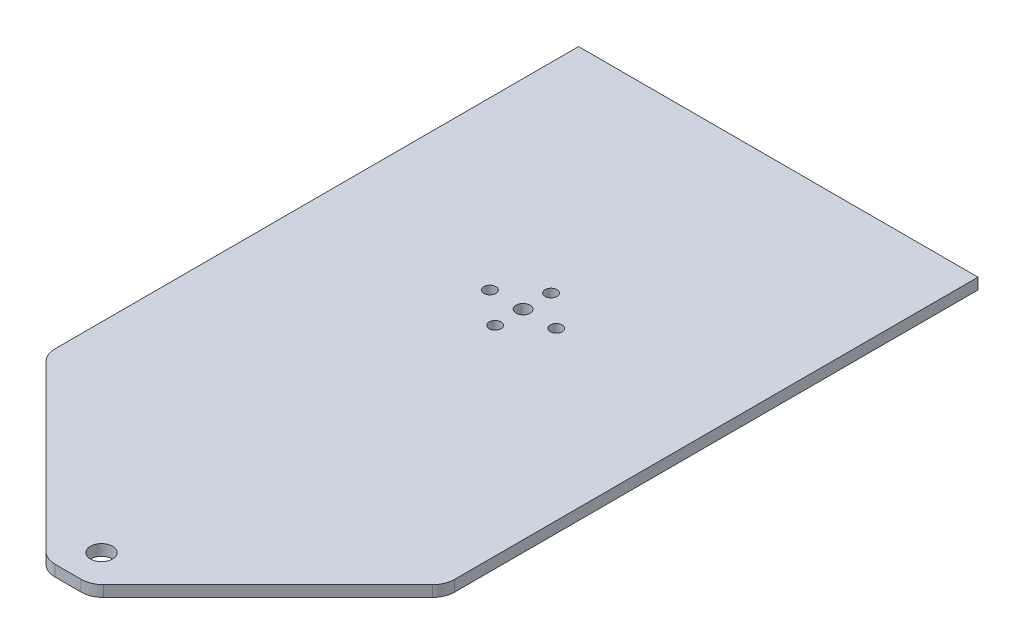
ISO-10303-21;
HEADER;
FILE_DESCRIPTION(('STEP AP214'),'2;1');
FILE_NAME('part.step','',(''),(''),'','','');
FILE_SCHEMA(('AUTOMOTIVE_DESIGN { 1 0 10303 214 1 1 1 1 }'));
ENDSEC;
DATA;
#1=APPLICATION_CONTEXT('core data for automotive mechanical design processes');
#2=APPLICATION_PROTOCOL_DEFINITION('international standard','automotive_design',2000,#1);
#3=PRODUCT_CONTEXT('',#1,'mechanical');
#4=PRODUCT('Part','Part','',(#3));
#5=PRODUCT_RELATED_PRODUCT_CATEGORY('part','',(#4));
#6=PRODUCT_DEFINITION_FORMATION('','',#4);
#7=PRODUCT_DEFINITION_CONTEXT('part definition',#1,'design');
#8=PRODUCT_DEFINITION('design','',#6,#7);
#9=PRODUCT_DEFINITION_SHAPE('','',#8);
#10=(LENGTH_UNIT() NAMED_UNIT(*) SI_UNIT(.MILLI.,.METRE.));
#11=(NAMED_UNIT(*) PLANE_ANGLE_UNIT() SI_UNIT($,.RADIAN.));
#12=(NAMED_UNIT(*) SI_UNIT($,.STERADIAN.) SOLID_ANGLE_UNIT());
#13=UNCERTAINTY_MEASURE_WITH_UNIT(LENGTH_MEASURE(1.E-05),#10,'distance_accuracy_value','');
#14=(GEOMETRIC_REPRESENTATION_CONTEXT(3) GLOBAL_UNCERTAINTY_ASSIGNED_CONTEXT((#13)) GLOBAL_UNIT_ASSIGNED_CONTEXT((#10,
#11,#12)) REPRESENTATION_CONTEXT('',''));
#15=CARTESIAN_POINT('',(0.,0.,0.));
#16=DIRECTION('',(0.,0.,1.));
#17=DIRECTION('',(1.,0.,0.));
#18=AXIS2_PLACEMENT_3D('',#15,#16,#17);
#19=CARTESIAN_POINT('',(50.8,3.175,149.769743878931));
#20=DIRECTION('',(0.,-1.,0.));
#21=DIRECTION('',(0.,0.,-1.));
#22=AXIS2_PLACEMENT_3D('',#19,#20,#21);
#23=PLANE('',#22);
#24=CARTESIAN_POINT('',(-9.5,3.175,73.025));
#25=DIRECTION('',(0.,1.,0.));
#26=DIRECTION('',(0.,0.,1.));
#27=AXIS2_PLACEMENT_3D('',#24,#25,#26);
#28=CIRCLE('',#27,1.7);
#29=CARTESIAN_POINT('',(-9.5,3.175,74.725));
#30=VERTEX_POINT('',#29);
#31=EDGE_CURVE('E234',#30,#30,#28,.T.);
#32=ORIENTED_EDGE('',*,*,#31,.F.);
#33=EDGE_LOOP('',(#32));
#34=FACE_BOUND('',#33,.T.);
#35=CARTESIAN_POINT('',(0.,3.175,81.025));
#36=DIRECTION('',(0.,1.,0.));
#37=DIRECTION('',(0.,0.,1.));
#38=AXIS2_PLACEMENT_3D('',#35,#36,#37);
#39=CIRCLE('',#38,1.7);
#40=CARTESIAN_POINT('',(0.,3.175,82.725));
#41=VERTEX_POINT('',#40);
#42=EDGE_CURVE('E228',#41,#41,#39,.T.);
#43=ORIENTED_EDGE('',*,*,#42,.F.);
#44=EDGE_LOOP('',(#43));
#45=FACE_BOUND('',#44,.T.);
#46=CARTESIAN_POINT('',(9.5,3.175,73.025));
#47=DIRECTION('',(0.,1.,0.));
#48=DIRECTION('',(0.,0.,1.));
#49=AXIS2_PLACEMENT_3D('',#46,#47,#48);
#50=CIRCLE('',#49,1.7);
#51=CARTESIAN_POINT('',(9.5,3.175,74.725));
#52=VERTEX_POINT('',#51);
#53=EDGE_CURVE('E220',#52,#52,#50,.T.);
#54=ORIENTED_EDGE('',*,*,#53,.F.);
#55=EDGE_LOOP('',(#54));
#56=FACE_BOUND('',#55,.T.);
#57=CARTESIAN_POINT('',(0.,3.175,73.025));
#58=DIRECTION('',(0.,1.,0.));
#59=DIRECTION('',(0.,0.,1.));
#60=AXIS2_PLACEMENT_3D('',#57,#58,#59);
#61=CIRCLE('',#60,2.);
#62=CARTESIAN_POINT('',(0.,3.175,75.025));
#63=VERTEX_POINT('',#62);
#64=EDGE_CURVE('E214',#63,#63,#61,.T.);
#65=ORIENTED_EDGE('',*,*,#64,.F.);
#66=EDGE_LOOP('',(#65));
#67=FACE_BOUND('',#66,.T.);
#68=DIRECTION('',(0.,0.,-1.));
#69=VECTOR('',#68,1.);
#70=CARTESIAN_POINT('',(57.15,3.175,0.));
#71=LINE('',#70,#69);
#72=CARTESIAN_POINT('',(57.15,3.175,149.769743878931));
#73=VERTEX_POINT('',#72);
#74=CARTESIAN_POINT('',(57.15,3.175,0.));
#75=VERTEX_POINT('',#74);
#76=EDGE_CURVE('E163',#73,#75,#71,.T.);
#77=ORIENTED_EDGE('',*,*,#76,.T.);
#78=DIRECTION('',(-1.,0.,0.));
#79=VECTOR('',#78,1.);
#80=CARTESIAN_POINT('',(-57.15,3.175,0.));
#81=LINE('',#80,#79);
#82=CARTESIAN_POINT('',(-57.15,3.175,0.));
#83=VERTEX_POINT('',#82);
#84=EDGE_CURVE('E101',#75,#83,#81,.T.);
#85=ORIENTED_EDGE('',*,*,#84,.T.);
#86=DIRECTION('',(0.,0.,1.));
#87=VECTOR('',#86,1.);
#88=CARTESIAN_POINT('',(-57.15,3.175,0.));
#89=LINE('',#88,#87);
#90=CARTESIAN_POINT('',(-57.15,3.175,149.769743878931));
#91=VERTEX_POINT('',#90);
#92=EDGE_CURVE('E184',#83,#91,#89,.T.);
#93=ORIENTED_EDGE('',*,*,#92,.T.);
#94=CARTESIAN_POINT('',(-50.8,3.175,149.769743878931));
#95=DIRECTION('',(0.,1.,0.));
#96=DIRECTION('',(0.,0.,-1.));
#97=AXIS2_PLACEMENT_3D('',#94,#95,#96);
#98=CIRCLE('',#97,6.35000000000001);
#99=CARTESIAN_POINT('',(-55.2901280605345,3.175,154.259871939465));
#100=VERTEX_POINT('',#99);
#101=EDGE_CURVE('E203',#91,#100,#98,.T.);
#102=ORIENTED_EDGE('',*,*,#101,.T.);
#103=DIRECTION('',(0.707106781186547,0.,0.707106781186547));
#104=VECTOR('',#103,1.);
#105=CARTESIAN_POINT('',(-55.2901280605345,3.175,154.259871939465));
#106=LINE('',#105,#104);
#107=CARTESIAN_POINT('',(-8.20987193946543,3.175,201.340128060535));
#108=VERTEX_POINT('',#107);
#109=EDGE_CURVE('E200',#100,#108,#106,.T.);
#110=ORIENTED_EDGE('',*,*,#109,.T.);
#111=CARTESIAN_POINT('',(-3.71974387893084,3.175,196.85));
#112=DIRECTION('',(0.,1.,0.));
#113=DIRECTION('',(0.,0.,-1.));
#114=AXIS2_PLACEMENT_3D('',#111,#112,#113);
#115=CIRCLE('',#114,6.35000000000001);
#116=CARTESIAN_POINT('',(-3.71974387893084,3.175,203.2));
#117=VERTEX_POINT('',#116);
#118=EDGE_CURVE('E202',#108,#117,#115,.T.);
#119=ORIENTED_EDGE('',*,*,#118,.T.);
#120=DIRECTION('',(1.,0.,0.));
#121=VECTOR('',#120,1.);
#122=CARTESIAN_POINT('',(3.71974387893089,3.175,203.2));
#123=LINE('',#122,#121);
#124=CARTESIAN_POINT('',(3.71974387893089,3.175,203.2));
#125=VERTEX_POINT('',#124);
#126=EDGE_CURVE('E126',#117,#125,#123,.T.);
#127=ORIENTED_EDGE('',*,*,#126,.T.);
#128=CARTESIAN_POINT('',(3.71974387893089,3.175,196.85));
#129=DIRECTION('',(0.,1.,0.));
#130=DIRECTION('',(0.,0.,-1.));
#131=AXIS2_PLACEMENT_3D('',#128,#129,#130);
#132=CIRCLE('',#131,6.35000000000001);
#133=CARTESIAN_POINT('',(8.20987193946547,3.175,201.340128060535));
#134=VERTEX_POINT('',#133);
#135=EDGE_CURVE('E120',#125,#134,#132,.T.);
#136=ORIENTED_EDGE('',*,*,#135,.T.);
#137=DIRECTION('',(0.707106781186547,0.,-0.707106781186547));
#138=VECTOR('',#137,1.);
#139=CARTESIAN_POINT('',(55.2901280605346,3.175,154.259871939465));
#140=LINE('',#139,#138);
#141=CARTESIAN_POINT('',(55.2901280605346,3.175,154.259871939465));
#142=VERTEX_POINT('',#141);
#143=EDGE_CURVE('E124',#134,#142,#140,.T.);
#144=ORIENTED_EDGE('',*,*,#143,.T.);
#145=CARTESIAN_POINT('',(50.8,3.175,149.769743878931));
#146=DIRECTION('',(0.,1.,0.));
#147=DIRECTION('',(0.,0.,-1.));
#148=AXIS2_PLACEMENT_3D('',#145,#146,#147);
#149=CIRCLE('',#148,6.35000000000001);
#150=EDGE_CURVE('E52',#142,#73,#149,.T.);
#151=ORIENTED_EDGE('',*,*,#150,.T.);
#152=EDGE_LOOP('',(#77,#85,#93,#102,#110,#119,#127,#136,#144,#151));
#153=FACE_BOUND('',#152,.T.);
#154=CARTESIAN_POINT('',(0.,3.175,193.675));
#155=DIRECTION('',(0.,1.,0.));
#156=DIRECTION('',(0.,0.,1.));
#157=AXIS2_PLACEMENT_3D('',#154,#155,#156);
#158=CIRCLE('',#157,3.175);
#159=CARTESIAN_POINT('',(0.,3.175,196.85));
#160=VERTEX_POINT('',#159);
#161=EDGE_CURVE('E148',#160,#160,#158,.T.);
#162=ORIENTED_EDGE('',*,*,#161,.F.);
#163=EDGE_LOOP('',(#162));
#164=FACE_BOUND('',#163,.T.);
#165=CARTESIAN_POINT('',(0.,3.175,65.025));
#166=DIRECTION('',(0.,1.,0.));
#167=DIRECTION('',(0.,0.,1.));
#168=AXIS2_PLACEMENT_3D('',#165,#166,#167);
#169=CIRCLE('',#168,1.7);
#170=CARTESIAN_POINT('',(0.,3.175,66.725));
#171=VERTEX_POINT('',#170);
#172=EDGE_CURVE('E240',#171,#171,#169,.T.);
#173=ORIENTED_EDGE('',*,*,#172,.F.);
#174=EDGE_LOOP('',(#173));
#175=FACE_BOUND('',#174,.T.);
#176=ADVANCED_FACE('F35',(#34,#45,#56,#67,#153,#164,#175),#23,.F.);
#177=CARTESIAN_POINT('',(50.8,0.,149.769743878931));
#178=DIRECTION('',(0.,-1.,0.));
#179=DIRECTION('',(0.,0.,-1.));
#180=AXIS2_PLACEMENT_3D('',#177,#178,#179);
#181=PLANE('',#180);
#182=CARTESIAN_POINT('',(0.,0.,65.025));
#183=DIRECTION('',(0.,1.,0.));
#184=DIRECTION('',(0.,0.,1.));
#185=AXIS2_PLACEMENT_3D('',#182,#183,#184);
#186=CIRCLE('',#185,1.7);
#187=CARTESIAN_POINT('',(0.,0.,66.725));
#188=VERTEX_POINT('',#187);
#189=EDGE_CURVE('E243',#188,#188,#186,.T.);
#190=ORIENTED_EDGE('',*,*,#189,.T.);
#191=EDGE_LOOP('',(#190));
#192=FACE_BOUND('',#191,.T.);
#193=CARTESIAN_POINT('',(-9.5,0.,73.025));
#194=DIRECTION('',(0.,1.,0.));
#195=DIRECTION('',(0.,0.,1.));
#196=AXIS2_PLACEMENT_3D('',#193,#194,#195);
#197=CIRCLE('',#196,1.7);
#198=CARTESIAN_POINT('',(-9.5,0.,74.725));
#199=VERTEX_POINT('',#198);
#200=EDGE_CURVE('E237',#199,#199,#197,.T.);
#201=ORIENTED_EDGE('',*,*,#200,.T.);
#202=EDGE_LOOP('',(#201));
#203=FACE_BOUND('',#202,.T.);
#204=CARTESIAN_POINT('',(0.,0.,81.025));
#205=DIRECTION('',(0.,1.,0.));
#206=DIRECTION('',(0.,0.,1.));
#207=AXIS2_PLACEMENT_3D('',#204,#205,#206);
#208=CIRCLE('',#207,1.7);
#209=CARTESIAN_POINT('',(0.,0.,82.725));
#210=VERTEX_POINT('',#209);
#211=EDGE_CURVE('E231',#210,#210,#208,.T.);
#212=ORIENTED_EDGE('',*,*,#211,.T.);
#213=EDGE_LOOP('',(#212));
#214=FACE_BOUND('',#213,.T.);
#215=CARTESIAN_POINT('',(9.5,0.,73.025));
#216=DIRECTION('',(0.,1.,0.));
#217=DIRECTION('',(0.,0.,1.));
#218=AXIS2_PLACEMENT_3D('',#215,#216,#217);
#219=CIRCLE('',#218,1.7);
#220=CARTESIAN_POINT('',(9.5,0.,74.725));
#221=VERTEX_POINT('',#220);
#222=EDGE_CURVE('E225',#221,#221,#219,.T.);
#223=ORIENTED_EDGE('',*,*,#222,.T.);
#224=EDGE_LOOP('',(#223));
#225=FACE_BOUND('',#224,.T.);
#226=CARTESIAN_POINT('',(0.,0.,73.025));
#227=DIRECTION('',(0.,-1.,0.));
#228=DIRECTION('',(0.,0.,-1.));
#229=AXIS2_PLACEMENT_3D('',#226,#227,#228);
#230=CIRCLE('',#229,2.);
#231=CARTESIAN_POINT('',(0.,0.,71.025));
#232=VERTEX_POINT('',#231);
#233=EDGE_CURVE('E217',#232,#232,#230,.F.);
#234=ORIENTED_EDGE('',*,*,#233,.T.);
#235=EDGE_LOOP('',(#234));
#236=FACE_BOUND('',#235,.T.);
#237=DIRECTION('',(0.,0.,-1.));
#238=VECTOR('',#237,1.);
#239=CARTESIAN_POINT('',(57.15,0.,0.));
#240=LINE('',#239,#238);
#241=CARTESIAN_POINT('',(57.15,0.,149.769743878931));
#242=VERTEX_POINT('',#241);
#243=CARTESIAN_POINT('',(57.15,0.,0.));
#244=VERTEX_POINT('',#243);
#245=EDGE_CURVE('E144',#242,#244,#240,.T.);
#246=ORIENTED_EDGE('',*,*,#245,.F.);
#247=CARTESIAN_POINT('',(50.8,0.,149.769743878931));
#248=DIRECTION('',(0.,1.,0.));
#249=DIRECTION('',(0.,0.,-1.));
#250=AXIS2_PLACEMENT_3D('',#247,#248,#249);
#251=CIRCLE('',#250,6.35000000000001);
#252=CARTESIAN_POINT('',(55.2901280605346,0.,154.259871939465));
#253=VERTEX_POINT('',#252);
#254=EDGE_CURVE('E93',#253,#242,#251,.T.);
#255=ORIENTED_EDGE('',*,*,#254,.F.);
#256=DIRECTION('',(0.707106781186547,0.,-0.707106781186547));
#257=VECTOR('',#256,1.);
#258=CARTESIAN_POINT('',(55.2901280605346,0.,154.259871939465));
#259=LINE('',#258,#257);
#260=CARTESIAN_POINT('',(8.20987193946547,0.,201.340128060535));
#261=VERTEX_POINT('',#260);
#262=EDGE_CURVE('E87',#261,#253,#259,.T.);
#263=ORIENTED_EDGE('',*,*,#262,.F.);
#264=CARTESIAN_POINT('',(3.71974387893089,0.,196.85));
#265=DIRECTION('',(0.,1.,0.));
#266=DIRECTION('',(0.,0.,-1.));
#267=AXIS2_PLACEMENT_3D('',#264,#265,#266);
#268=CIRCLE('',#267,6.35000000000001);
#269=CARTESIAN_POINT('',(3.71974387893089,0.,203.2));
#270=VERTEX_POINT('',#269);
#271=EDGE_CURVE('E134',#270,#261,#268,.T.);
#272=ORIENTED_EDGE('',*,*,#271,.F.);
#273=DIRECTION('',(1.,0.,0.));
#274=VECTOR('',#273,1.);
#275=CARTESIAN_POINT('',(3.71974387893089,0.,203.2));
#276=LINE('',#275,#274);
#277=CARTESIAN_POINT('',(-3.71974387893084,0.,203.2));
#278=VERTEX_POINT('',#277);
#279=EDGE_CURVE('E158',#278,#270,#276,.T.);
#280=ORIENTED_EDGE('',*,*,#279,.F.);
#281=CARTESIAN_POINT('',(-3.71974387893084,0.,196.85));
#282=DIRECTION('',(0.,1.,0.));
#283=DIRECTION('',(0.,0.,-1.));
#284=AXIS2_PLACEMENT_3D('',#281,#282,#283);
#285=CIRCLE('',#284,6.35000000000001);
#286=CARTESIAN_POINT('',(-8.20987193946543,0.,201.340128060535));
#287=VERTEX_POINT('',#286);
#288=EDGE_CURVE('E156',#287,#278,#285,.T.);
#289=ORIENTED_EDGE('',*,*,#288,.F.);
#290=DIRECTION('',(0.707106781186547,0.,0.707106781186547));
#291=VECTOR('',#290,1.);
#292=CARTESIAN_POINT('',(-55.2901280605345,0.,154.259871939465));
#293=LINE('',#292,#291);
#294=CARTESIAN_POINT('',(-55.2901280605345,0.,154.259871939465));
#295=VERTEX_POINT('',#294);
#296=EDGE_CURVE('E154',#295,#287,#293,.T.);
#297=ORIENTED_EDGE('',*,*,#296,.F.);
#298=CARTESIAN_POINT('',(-50.8,0.,149.769743878931));
#299=DIRECTION('',(0.,1.,0.));
#300=DIRECTION('',(0.,0.,-1.));
#301=AXIS2_PLACEMENT_3D('',#298,#299,#300);
#302=CIRCLE('',#301,6.35000000000001);
#303=CARTESIAN_POINT('',(-57.15,0.,149.769743878931));
#304=VERTEX_POINT('',#303);
#305=EDGE_CURVE('E152',#304,#295,#302,.T.);
#306=ORIENTED_EDGE('',*,*,#305,.F.);
#307=DIRECTION('',(0.,0.,1.));
#308=VECTOR('',#307,1.);
#309=CARTESIAN_POINT('',(-57.15,0.,0.));
#310=LINE('',#309,#308);
#311=CARTESIAN_POINT('',(-57.15,0.,0.));
#312=VERTEX_POINT('',#311);
#313=EDGE_CURVE('E150',#312,#304,#310,.T.);
#314=ORIENTED_EDGE('',*,*,#313,.F.);
#315=DIRECTION('',(-1.,0.,0.));
#316=VECTOR('',#315,1.);
#317=CARTESIAN_POINT('',(-57.15,0.,0.));
#318=LINE('',#317,#316);
#319=EDGE_CURVE('E147',#244,#312,#318,.T.);
#320=ORIENTED_EDGE('',*,*,#319,.F.);
#321=EDGE_LOOP('',(#246,#255,#263,#272,#280,#289,#297,#306,#314,#320));
#322=FACE_BOUND('',#321,.T.);
#323=CARTESIAN_POINT('',(0.,0.,193.675));
#324=DIRECTION('',(0.,1.,0.));
#325=DIRECTION('',(0.,0.,1.));
#326=AXIS2_PLACEMENT_3D('',#323,#324,#325);
#327=CIRCLE('',#326,3.175);
#328=CARTESIAN_POINT('',(0.,0.,196.85));
#329=VERTEX_POINT('',#328);
#330=EDGE_CURVE('E211',#329,#329,#327,.T.);
#331=ORIENTED_EDGE('',*,*,#330,.T.);
#332=EDGE_LOOP('',(#331));
#333=FACE_BOUND('',#332,.T.);
#334=ADVANCED_FACE('F188',(#192,#203,#214,#225,#236,#322,#333),#181,.T.);
#335=CARTESIAN_POINT('',(57.15,3.175,0.));
#336=DIRECTION('',(-1.,0.,0.));
#337=DIRECTION('',(0.,0.,1.));
#338=AXIS2_PLACEMENT_3D('',#335,#336,#337);
#339=PLANE('',#338);
#340=ORIENTED_EDGE('',*,*,#245,.T.);
#341=DIRECTION('',(0.,-1.,0.));
#342=VECTOR('',#341,1.);
#343=CARTESIAN_POINT('',(57.15,3.175,0.));
#344=LINE('',#343,#342);
#345=EDGE_CURVE('E11',#75,#244,#344,.T.);
#346=ORIENTED_EDGE('',*,*,#345,.F.);
#347=ORIENTED_EDGE('',*,*,#76,.F.);
#348=DIRECTION('',(0.,-1.,0.));
#349=VECTOR('',#348,1.);
#350=CARTESIAN_POINT('',(57.15,3.175,149.769743878931));
#351=LINE('',#350,#349);
#352=EDGE_CURVE('E140',#73,#242,#351,.T.);
#353=ORIENTED_EDGE('',*,*,#352,.T.);
#354=EDGE_LOOP('',(#340,#346,#347,#353));
#355=FACE_BOUND('',#354,.T.);
#356=ADVANCED_FACE('F37',(#355),#339,.F.);
#357=CARTESIAN_POINT('',(-57.15,3.175,0.));
#358=DIRECTION('',(0.,0.,1.));
#359=DIRECTION('',(1.,0.,0.));
#360=AXIS2_PLACEMENT_3D('',#357,#358,#359);
#361=PLANE('',#360);
#362=ORIENTED_EDGE('',*,*,#319,.T.);
#363=DIRECTION('',(0.,-1.,0.));
#364=VECTOR('',#363,1.);
#365=CARTESIAN_POINT('',(-57.15,3.175,0.));
#366=LINE('',#365,#364);
#367=EDGE_CURVE('E44',#83,#312,#366,.T.);
#368=ORIENTED_EDGE('',*,*,#367,.F.);
#369=ORIENTED_EDGE('',*,*,#84,.F.);
#370=ORIENTED_EDGE('',*,*,#345,.T.);
#371=EDGE_LOOP('',(#362,#368,#369,#370));
#372=FACE_BOUND('',#371,.T.);
#373=ADVANCED_FACE('F289',(#372),#361,.F.);
#374=CARTESIAN_POINT('',(-57.15,3.175,0.));
#375=DIRECTION('',(1.,0.,0.));
#376=DIRECTION('',(0.,0.,-1.));
#377=AXIS2_PLACEMENT_3D('',#374,#375,#376);
#378=PLANE('',#377);
#379=ORIENTED_EDGE('',*,*,#313,.T.);
#380=DIRECTION('',(0.,-1.,0.));
#381=VECTOR('',#380,1.);
#382=CARTESIAN_POINT('',(-57.15,3.175,149.769743878931));
#383=LINE('',#382,#381);
#384=EDGE_CURVE('E176',#91,#304,#383,.T.);
#385=ORIENTED_EDGE('',*,*,#384,.F.);
#386=ORIENTED_EDGE('',*,*,#92,.F.);
#387=ORIENTED_EDGE('',*,*,#367,.T.);
#388=EDGE_LOOP('',(#379,#385,#386,#387));
#389=FACE_BOUND('',#388,.T.);
#390=ADVANCED_FACE('F182',(#389),#378,.F.);
#391=CARTESIAN_POINT('',(-50.8,3.175,149.769743878931));
#392=DIRECTION('',(0.,-1.,0.));
#393=DIRECTION('',(0.,0.,-1.));
#394=AXIS2_PLACEMENT_3D('',#391,#392,#393);
#395=CYLINDRICAL_SURFACE('',#394,6.35000000000001);
#396=ORIENTED_EDGE('',*,*,#305,.T.);
#397=DIRECTION('',(0.,-1.,0.));
#398=VECTOR('',#397,1.);
#399=CARTESIAN_POINT('',(-55.2901280605345,3.175,154.259871939465));
#400=LINE('',#399,#398);
#401=EDGE_CURVE('E173',#100,#295,#400,.T.);
#402=ORIENTED_EDGE('',*,*,#401,.F.);
#403=ORIENTED_EDGE('',*,*,#101,.F.);
#404=ORIENTED_EDGE('',*,*,#384,.T.);
#405=EDGE_LOOP('',(#396,#402,#403,#404));
#406=FACE_BOUND('',#405,.T.);
#407=ADVANCED_FACE('F194',(#406),#395,.T.);
#408=CARTESIAN_POINT('',(-55.2901280605345,3.175,154.259871939465));
#409=DIRECTION('',(0.707106781186548,0.,-0.707106781186548));
#410=DIRECTION('',(-0.707106781186548,0.,-0.707106781186548));
#411=AXIS2_PLACEMENT_3D('',#408,#409,#410);
#412=PLANE('',#411);
#413=ORIENTED_EDGE('',*,*,#296,.T.);
#414=DIRECTION('',(0.,-1.,0.));
#415=VECTOR('',#414,1.);
#416=CARTESIAN_POINT('',(-8.20987193946543,3.175,201.340128060535));
#417=LINE('',#416,#415);
#418=EDGE_CURVE('E170',#108,#287,#417,.T.);
#419=ORIENTED_EDGE('',*,*,#418,.F.);
#420=ORIENTED_EDGE('',*,*,#109,.F.);
#421=ORIENTED_EDGE('',*,*,#401,.T.);
#422=EDGE_LOOP('',(#413,#419,#420,#421));
#423=FACE_BOUND('',#422,.T.);
#424=ADVANCED_FACE('F198',(#423),#412,.F.);
#425=CARTESIAN_POINT('',(-3.71974387893084,3.175,196.85));
#426=DIRECTION('',(0.,-1.,0.));
#427=DIRECTION('',(0.,0.,-1.));
#428=AXIS2_PLACEMENT_3D('',#425,#426,#427);
#429=CYLINDRICAL_SURFACE('',#428,6.35000000000001);
#430=ORIENTED_EDGE('',*,*,#288,.T.);
#431=DIRECTION('',(0.,-1.,0.));
#432=VECTOR('',#431,1.);
#433=CARTESIAN_POINT('',(-3.71974387893084,3.175,203.2));
#434=LINE('',#433,#432);
#435=EDGE_CURVE('E167',#117,#278,#434,.T.);
#436=ORIENTED_EDGE('',*,*,#435,.F.);
#437=ORIENTED_EDGE('',*,*,#118,.F.);
#438=ORIENTED_EDGE('',*,*,#418,.T.);
#439=EDGE_LOOP('',(#430,#436,#437,#438));
#440=FACE_BOUND('',#439,.T.);
#441=ADVANCED_FACE('F279',(#440),#429,.T.);
#442=CARTESIAN_POINT('',(3.71974387893089,3.175,203.2));
#443=DIRECTION('',(0.,0.,-1.));
#444=DIRECTION('',(-1.,0.,0.));
#445=AXIS2_PLACEMENT_3D('',#442,#443,#444);
#446=PLANE('',#445);
#447=ORIENTED_EDGE('',*,*,#279,.T.);
#448=DIRECTION('',(0.,-1.,0.));
#449=VECTOR('',#448,1.);
#450=CARTESIAN_POINT('',(3.71974387893089,3.175,203.2));
#451=LINE('',#450,#449);
#452=EDGE_CURVE('E135',#125,#270,#451,.T.);
#453=ORIENTED_EDGE('',*,*,#452,.F.);
#454=ORIENTED_EDGE('',*,*,#126,.F.);
#455=ORIENTED_EDGE('',*,*,#435,.T.);
#456=EDGE_LOOP('',(#447,#453,#454,#455));
#457=FACE_BOUND('',#456,.T.);
#458=ADVANCED_FACE('F276',(#457),#446,.F.);
#459=CARTESIAN_POINT('',(3.71974387893089,3.175,196.85));
#460=DIRECTION('',(0.,-1.,0.));
#461=DIRECTION('',(0.,0.,-1.));
#462=AXIS2_PLACEMENT_3D('',#459,#460,#461);
#463=CYLINDRICAL_SURFACE('',#462,6.35000000000001);
#464=ORIENTED_EDGE('',*,*,#271,.T.);
#465=DIRECTION('',(0.,-1.,0.));
#466=VECTOR('',#465,1.);
#467=CARTESIAN_POINT('',(8.20987193946547,3.175,201.340128060535));
#468=LINE('',#467,#466);
#469=EDGE_CURVE('E131',#134,#261,#468,.T.);
#470=ORIENTED_EDGE('',*,*,#469,.F.);
#471=ORIENTED_EDGE('',*,*,#135,.F.);
#472=ORIENTED_EDGE('',*,*,#452,.T.);
#473=EDGE_LOOP('',(#464,#470,#471,#472));
#474=FACE_BOUND('',#473,.T.);
#475=ADVANCED_FACE('F132',(#474),#463,.T.);
#476=CARTESIAN_POINT('',(55.2901280605346,3.175,154.259871939465));
#477=DIRECTION('',(-0.707106781186548,0.,-0.707106781186548));
#478=DIRECTION('',(-0.707106781186548,0.,0.707106781186548));
#479=AXIS2_PLACEMENT_3D('',#476,#477,#478);
#480=PLANE('',#479);
#481=ORIENTED_EDGE('',*,*,#262,.T.);
#482=DIRECTION('',(0.,-1.,0.));
#483=VECTOR('',#482,1.);
#484=CARTESIAN_POINT('',(55.2901280605346,3.175,154.259871939465));
#485=LINE('',#484,#483);
#486=EDGE_CURVE('E136',#142,#253,#485,.T.);
#487=ORIENTED_EDGE('',*,*,#486,.F.);
#488=ORIENTED_EDGE('',*,*,#143,.F.);
#489=ORIENTED_EDGE('',*,*,#469,.T.);
#490=EDGE_LOOP('',(#481,#487,#488,#489));
#491=FACE_BOUND('',#490,.T.);
#492=ADVANCED_FACE('F138',(#491),#480,.F.);
#493=CARTESIAN_POINT('',(50.8,3.175,149.769743878931));
#494=DIRECTION('',(0.,-1.,0.));
#495=DIRECTION('',(0.,0.,-1.));
#496=AXIS2_PLACEMENT_3D('',#493,#494,#495);
#497=CYLINDRICAL_SURFACE('',#496,6.35000000000001);
#498=ORIENTED_EDGE('',*,*,#254,.T.);
#499=ORIENTED_EDGE('',*,*,#352,.F.);
#500=ORIENTED_EDGE('',*,*,#150,.F.);
#501=ORIENTED_EDGE('',*,*,#486,.T.);
#502=EDGE_LOOP('',(#498,#499,#500,#501));
#503=FACE_BOUND('',#502,.T.);
#504=ADVANCED_FACE('F269',(#503),#497,.T.);
#505=CARTESIAN_POINT('',(0.,3.175,193.675));
#506=DIRECTION('',(0.,-1.,0.));
#507=DIRECTION('',(0.,0.,-1.));
#508=AXIS2_PLACEMENT_3D('',#505,#506,#507);
#509=CYLINDRICAL_SURFACE('',#508,3.175);
#510=ORIENTED_EDGE('',*,*,#161,.T.);
#511=EDGE_LOOP('',(#510));
#512=FACE_BOUND('',#511,.T.);
#513=ORIENTED_EDGE('',*,*,#330,.F.);
#514=EDGE_LOOP('',(#513));
#515=FACE_BOUND('',#514,.T.);
#516=ADVANCED_FACE('F266',(#512,#515),#509,.F.);
#517=CARTESIAN_POINT('',(0.,-0.00100000000000013,73.025));
#518=DIRECTION('',(0.,1.,0.));
#519=DIRECTION('',(0.,0.,1.));
#520=AXIS2_PLACEMENT_3D('',#517,#518,#519);
#521=CYLINDRICAL_SURFACE('',#520,2.);
#522=ORIENTED_EDGE('',*,*,#233,.F.);
#523=EDGE_LOOP('',(#522));
#524=FACE_BOUND('',#523,.T.);
#525=ORIENTED_EDGE('',*,*,#64,.T.);
#526=EDGE_LOOP('',(#525));
#527=FACE_BOUND('',#526,.T.);
#528=ADVANCED_FACE('F319',(#524,#527),#521,.F.);
#529=CARTESIAN_POINT('',(9.5,3.175,73.025));
#530=DIRECTION('',(0.,1.,0.));
#531=DIRECTION('',(0.,0.,1.));
#532=AXIS2_PLACEMENT_3D('',#529,#530,#531);
#533=CYLINDRICAL_SURFACE('',#532,1.7);
#534=ORIENTED_EDGE('',*,*,#222,.F.);
#535=EDGE_LOOP('',(#534));
#536=FACE_BOUND('',#535,.T.);
#537=ORIENTED_EDGE('',*,*,#53,.T.);
#538=EDGE_LOOP('',(#537));
#539=FACE_BOUND('',#538,.T.);
#540=ADVANCED_FACE('F313',(#536,#539),#533,.F.);
#541=CARTESIAN_POINT('',(0.,3.175,81.025));
#542=DIRECTION('',(0.,1.,0.));
#543=DIRECTION('',(0.,0.,1.));
#544=AXIS2_PLACEMENT_3D('',#541,#542,#543);
#545=CYLINDRICAL_SURFACE('',#544,1.7);
#546=ORIENTED_EDGE('',*,*,#211,.F.);
#547=EDGE_LOOP('',(#546));
#548=FACE_BOUND('',#547,.T.);
#549=ORIENTED_EDGE('',*,*,#42,.T.);
#550=EDGE_LOOP('',(#549));
#551=FACE_BOUND('',#550,.T.);
#552=ADVANCED_FACE('F318',(#548,#551),#545,.F.);
#553=CARTESIAN_POINT('',(-9.5,3.175,73.025));
#554=DIRECTION('',(0.,1.,0.));
#555=DIRECTION('',(0.,0.,1.));
#556=AXIS2_PLACEMENT_3D('',#553,#554,#555);
#557=CYLINDRICAL_SURFACE('',#556,1.7);
#558=ORIENTED_EDGE('',*,*,#200,.F.);
#559=EDGE_LOOP('',(#558));
#560=FACE_BOUND('',#559,.T.);
#561=ORIENTED_EDGE('',*,*,#31,.T.);
#562=EDGE_LOOP('',(#561));
#563=FACE_BOUND('',#562,.T.);
#564=ADVANCED_FACE('F252',(#560,#563),#557,.F.);
#565=CARTESIAN_POINT('',(0.,3.175,65.025));
#566=DIRECTION('',(0.,1.,0.));
#567=DIRECTION('',(0.,0.,1.));
#568=AXIS2_PLACEMENT_3D('',#565,#566,#567);
#569=CYLINDRICAL_SURFACE('',#568,1.7);
#570=ORIENTED_EDGE('',*,*,#189,.F.);
#571=EDGE_LOOP('',(#570));
#572=FACE_BOUND('',#571,.T.);
#573=ORIENTED_EDGE('',*,*,#172,.T.);
#574=EDGE_LOOP('',(#573));
#575=FACE_BOUND('',#574,.T.);
#576=ADVANCED_FACE('F249',(#572,#575),#569,.F.);
#577=CLOSED_SHELL('',(#176,#334,#356,#373,#390,#407,#424,#441,#458,#475,#492,#504,#516,#528,
#540,#552,#564,#576));
#578=MANIFOLD_SOLID_BREP('B2',#577);
#579=ADVANCED_BREP_SHAPE_REPRESENTATION('',(#18,#578),#14);
#580=SHAPE_DEFINITION_REPRESENTATION(#9,#579);
ENDSEC;
END-ISO-10303-21;
